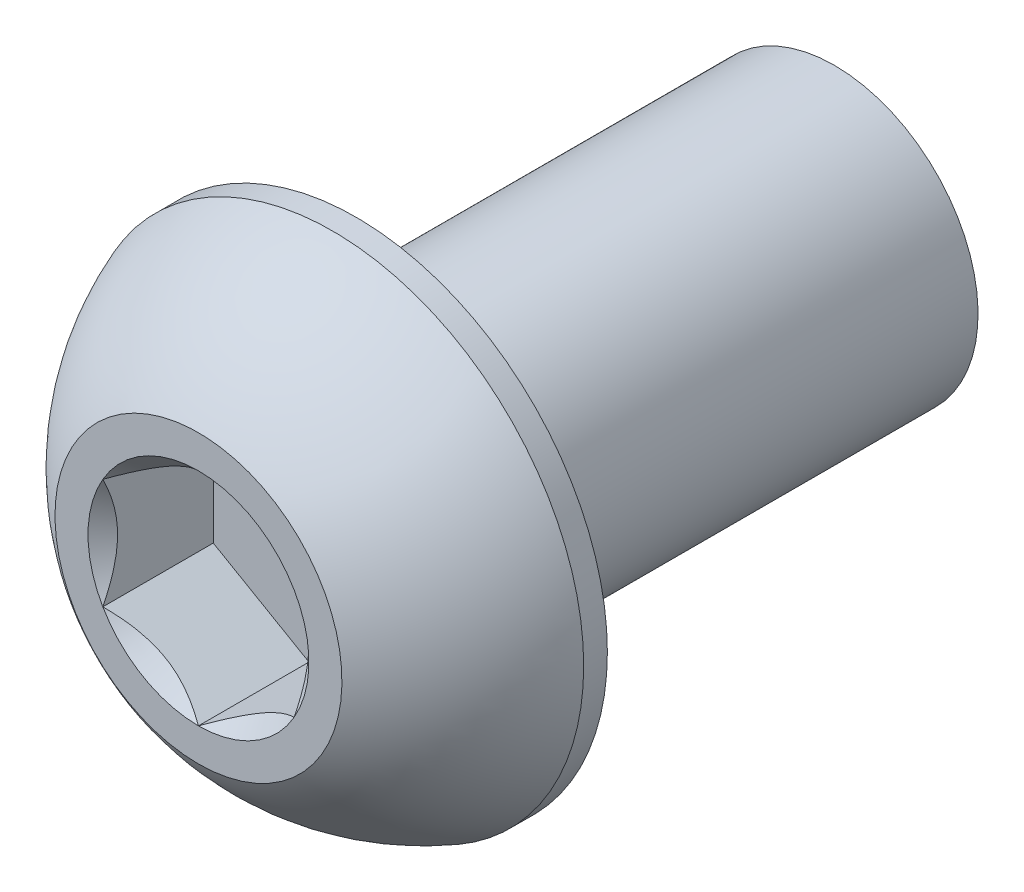
ISO-10303-21;
HEADER;
FILE_DESCRIPTION(('STEP AP214'),'2;1');
FILE_NAME('part.step','',(''),(''),'','','');
FILE_SCHEMA(('AUTOMOTIVE_DESIGN { 1 0 10303 214 1 1 1 1 }'));
ENDSEC;
DATA;
#1=APPLICATION_CONTEXT('core data for automotive mechanical design processes');
#2=APPLICATION_PROTOCOL_DEFINITION('international standard','automotive_design',2000,#1);
#3=PRODUCT_CONTEXT('',#1,'mechanical');
#4=PRODUCT('Part','Part','',(#3));
#5=PRODUCT_RELATED_PRODUCT_CATEGORY('part','',(#4));
#6=PRODUCT_DEFINITION_FORMATION('','',#4);
#7=PRODUCT_DEFINITION_CONTEXT('part definition',#1,'design');
#8=PRODUCT_DEFINITION('design','',#6,#7);
#9=PRODUCT_DEFINITION_SHAPE('','',#8);
#10=(LENGTH_UNIT() NAMED_UNIT(*) SI_UNIT(.MILLI.,.METRE.));
#11=(NAMED_UNIT(*) PLANE_ANGLE_UNIT() SI_UNIT($,.RADIAN.));
#12=(NAMED_UNIT(*) SI_UNIT($,.STERADIAN.) SOLID_ANGLE_UNIT());
#13=UNCERTAINTY_MEASURE_WITH_UNIT(LENGTH_MEASURE(1.E-05),#10,'distance_accuracy_value','');
#14=(GEOMETRIC_REPRESENTATION_CONTEXT(3) GLOBAL_UNCERTAINTY_ASSIGNED_CONTEXT((#13)) GLOBAL_UNIT_ASSIGNED_CONTEXT((#10,
#11,#12)) REPRESENTATION_CONTEXT('',''));
#15=CARTESIAN_POINT('',(0.,0.,0.));
#16=DIRECTION('',(0.,0.,1.));
#17=DIRECTION('',(1.,0.,0.));
#18=AXIS2_PLACEMENT_3D('',#15,#16,#17);
#19=CARTESIAN_POINT('',(-5.26,-5.25,-3.3));
#20=DIRECTION('',(0.,0.,-1.));
#21=DIRECTION('',(0.,1.,0.));
#22=AXIS2_PLACEMENT_3D('',#19,#20,#21);
#23=PLANE('',#22);
#24=CARTESIAN_POINT('',(0.,0.,-3.3));
#25=DIRECTION('',(0.,0.,1.));
#26=DIRECTION('',(1.,0.,0.));
#27=AXIS2_PLACEMENT_3D('',#24,#25,#26);
#28=CIRCLE('',#27,5.25);
#29=CARTESIAN_POINT('',(5.25,0.,-3.3));
#30=VERTEX_POINT('',#29);
#31=EDGE_CURVE('E371',#30,#30,#28,.T.);
#32=ORIENTED_EDGE('',*,*,#31,.F.);
#33=EDGE_LOOP('',(#32));
#34=FACE_BOUND('',#33,.T.);
#35=ADVANCED_FACE('F45',(#34),#23,.T.);
#36=CARTESIAN_POINT('',(2.,-1.15470053837925,-2.31));
#37=DIRECTION('',(0.,0.,1.));
#38=DIRECTION('',(1.,0.,0.));
#39=AXIS2_PLACEMENT_3D('',#36,#37,#38);
#40=PLANE('',#39);
#41=DIRECTION('',(0.866025403784438,0.5,0.));
#42=VECTOR('',#41,1.);
#43=CARTESIAN_POINT('',(0.,-2.3094010767585,-2.31));
#44=LINE('',#43,#42);
#45=CARTESIAN_POINT('',(0.,-2.3094010767585,-2.31));
#46=VERTEX_POINT('',#45);
#47=CARTESIAN_POINT('',(2.,-1.15470053837925,-2.31));
#48=VERTEX_POINT('',#47);
#49=EDGE_CURVE('E111',#46,#48,#44,.T.);
#50=ORIENTED_EDGE('',*,*,#49,.T.);
#51=DIRECTION('',(0.,1.,0.));
#52=VECTOR('',#51,1.);
#53=CARTESIAN_POINT('',(2.,-1.15470053837925,-2.31));
#54=LINE('',#53,#52);
#55=CARTESIAN_POINT('',(2.,1.15470053837925,-2.31));
#56=VERTEX_POINT('',#55);
#57=EDGE_CURVE('E168',#48,#56,#54,.T.);
#58=ORIENTED_EDGE('',*,*,#57,.T.);
#59=DIRECTION('',(-0.866025403784439,0.5,0.));
#60=VECTOR('',#59,1.);
#61=CARTESIAN_POINT('',(2.,1.15470053837925,-2.31));
#62=LINE('',#61,#60);
#63=CARTESIAN_POINT('',(0.,2.3094010767585,-2.31));
#64=VERTEX_POINT('',#63);
#65=EDGE_CURVE('E148',#56,#64,#62,.T.);
#66=ORIENTED_EDGE('',*,*,#65,.T.);
#67=DIRECTION('',(-0.866025403784438,-0.5,0.));
#68=VECTOR('',#67,1.);
#69=CARTESIAN_POINT('',(0.,2.3094010767585,-2.31));
#70=LINE('',#69,#68);
#71=CARTESIAN_POINT('',(-2.,1.15470053837925,-2.31));
#72=VERTEX_POINT('',#71);
#73=EDGE_CURVE('E164',#64,#72,#70,.T.);
#74=ORIENTED_EDGE('',*,*,#73,.T.);
#75=DIRECTION('',(0.,-1.,0.));
#76=VECTOR('',#75,1.);
#77=CARTESIAN_POINT('',(-2.,1.15470053837925,-2.31));
#78=LINE('',#77,#76);
#79=CARTESIAN_POINT('',(-2.,-1.15470053837925,-2.31));
#80=VERTEX_POINT('',#79);
#81=EDGE_CURVE('E161',#72,#80,#78,.T.);
#82=ORIENTED_EDGE('',*,*,#81,.T.);
#83=DIRECTION('',(0.866025403784439,-0.5,0.));
#84=VECTOR('',#83,1.);
#85=CARTESIAN_POINT('',(-2.,-1.15470053837925,-2.31));
#86=LINE('',#85,#84);
#87=EDGE_CURVE('E152',#80,#46,#86,.T.);
#88=ORIENTED_EDGE('',*,*,#87,.T.);
#89=EDGE_LOOP('',(#50,#58,#66,#74,#82,#88));
#90=FACE_BOUND('',#89,.T.);
#91=ADVANCED_FACE('F187',(#90),#40,.T.);
#92=CARTESIAN_POINT('',(-2.,-1.15470053837925,-2.31));
#93=DIRECTION('',(-0.5,-0.866025403784439,0.));
#94=DIRECTION('',(0.866025403784439,-0.5,0.));
#95=AXIS2_PLACEMENT_3D('',#92,#93,#94);
#96=PLANE('',#95);
#97=DIRECTION('',(0.,0.,1.));
#98=VECTOR('',#97,1.);
#99=CARTESIAN_POINT('',(-2.,-1.15470053837925,-2.31));
#100=LINE('',#99,#98);
#101=CARTESIAN_POINT('',(-2.,-1.15470053837925,0.));
#102=VERTEX_POINT('',#101);
#103=EDGE_CURVE('E118',#80,#102,#100,.T.);
#104=ORIENTED_EDGE('',*,*,#103,.T.);
#105=CARTESIAN_POINT('',(-2.0002,-1.15458506832541,0.000115478713659639));
#106=CARTESIAN_POINT('',(-1.93144696596929,-1.19427965103065,-0.039546909774408));
#107=CARTESIAN_POINT('',(-1.86154425786449,-1.23463799837204,-0.0768800177158382));
#108=CARTESIAN_POINT('',(-1.71900475544956,-1.31693321846145,-0.145236314863857));
#109=CARTESIAN_POINT('',(-1.64635440243464,-1.35887791933134,-0.176221466262779));
#110=CARTESIAN_POINT('',(-1.49985839894603,-1.44345742638069,-0.229299783455857));
#111=CARTESIAN_POINT('',(-1.42605006475371,-1.48607068799507,-0.251526372823389));
#112=CARTESIAN_POINT('',(-1.27680836816474,-1.57223542169503,-0.285771183324919));
#113=CARTESIAN_POINT('',(-1.20137956608185,-1.61578426088223,-0.297814970855865));
#114=CARTESIAN_POINT('',(-1.07138449932892,-1.69083694766536,-0.308681488094428));
#115=CARTESIAN_POINT('',(-1.01698621602989,-1.72224381117151,-0.310290246390029));
#116=CARTESIAN_POINT('',(-0.908278544480307,-1.78500621460364,-0.307581122401288));
#117=CARTESIAN_POINT('',(-0.853969194078661,-1.81636173267754,-0.303261162242026));
#118=CARTESIAN_POINT('',(-0.745863272410662,-1.87877671565355,-0.288940432590094));
#119=CARTESIAN_POINT('',(-0.692067343445208,-1.90983580972306,-0.278933307237993));
#120=CARTESIAN_POINT('',(-0.585405737694427,-1.97141691651548,-0.253787569750341));
#121=CARTESIAN_POINT('',(-0.532539989929288,-2.00193897021859,-0.23864935095776));
#122=CARTESIAN_POINT('',(-0.397120266910156,-2.08012358375727,-0.193705496570809));
#123=CARTESIAN_POINT('',(-0.315406165150521,-2.12730124240478,-0.160511160574184));
#124=CARTESIAN_POINT('',(-0.195252962742197,-2.19667172615922,-0.10447417682863));
#125=CARTESIAN_POINT('',(-0.155657147890822,-2.21953238052245,-0.0847852970530592));
#126=CARTESIAN_POINT('',(-0.0771990411121271,-2.26483018959124,-0.0436126816351277));
#127=CARTESIAN_POINT('',(-0.038336316406259,-2.28726759416161,-0.022130048348752));
#128=CARTESIAN_POINT('',(0.000200000000000792,-2.30951654681234,0.000115478713660523));
#129=B_SPLINE_CURVE_WITH_KNOTS('',3,(#105,#106,#107,#108,#109,#110,#111,#112,#113,#114,#115,
#116,#117,#118,#119,#120,#121,#122,#123,#124,#125,#126,#127,#128),.UNSPECIFIED.,.F.,.F.,(4,2,2,
2,2,2,2,2,2,2,2,4),(0.,0.266420613771064,0.534393751523388,0.798110374376914,1.06116288956936,
1.24939906803722,1.43770123566247,1.62621426093932,1.81471283831913,2.11415604834145,
2.26347170717791,2.41269626969771),.UNSPECIFIED.);
#130=CARTESIAN_POINT('',(0.,-2.3094010767585,0.));
#131=VERTEX_POINT('',#130);
#132=EDGE_CURVE('E103',#102,#131,#129,.T.);
#133=ORIENTED_EDGE('',*,*,#132,.T.);
#134=DIRECTION('',(0.,0.,1.));
#135=VECTOR('',#134,1.);
#136=CARTESIAN_POINT('',(0.,-2.3094010767585,-2.31));
#137=LINE('',#136,#135);
#138=EDGE_CURVE('E117',#46,#131,#137,.T.);
#139=ORIENTED_EDGE('',*,*,#138,.F.);
#140=ORIENTED_EDGE('',*,*,#87,.F.);
#141=EDGE_LOOP('',(#104,#133,#139,#140));
#142=FACE_BOUND('',#141,.T.);
#143=ADVANCED_FACE('F115',(#142),#96,.F.);
#144=CARTESIAN_POINT('',(0.,-2.3094010767585,-2.31));
#145=DIRECTION('',(0.5,-0.866025403784438,0.));
#146=DIRECTION('',(0.866025403784438,0.5,0.));
#147=AXIS2_PLACEMENT_3D('',#144,#145,#146);
#148=PLANE('',#147);
#149=ORIENTED_EDGE('',*,*,#138,.T.);
#150=CARTESIAN_POINT('',(-0.000199999999999157,-2.30951654681234,0.000115478713660375));
#151=CARTESIAN_POINT('',(0.0685530340307065,-2.26982196410711,-0.0395469097744072));
#152=CARTESIAN_POINT('',(0.138455742135513,-2.22946361676572,-0.0768800177158376));
#153=CARTESIAN_POINT('',(0.280995244550438,-2.1471683966763,-0.145236314863856));
#154=CARTESIAN_POINT('',(0.35364559756536,-2.10522369580642,-0.176221466262779));
#155=CARTESIAN_POINT('',(0.500141601053973,-2.02064418875706,-0.229299783455857));
#156=CARTESIAN_POINT('',(0.573949935246296,-1.97803092714269,-0.251526372823388));
#157=CARTESIAN_POINT('',(0.723191631835266,-1.89186619344273,-0.285771183324919));
#158=CARTESIAN_POINT('',(0.798620433918153,-1.84831735425552,-0.297814970855864));
#159=CARTESIAN_POINT('',(0.928615500671081,-1.7732646674724,-0.308681488094428));
#160=CARTESIAN_POINT('',(0.98301378397011,-1.74185780396625,-0.310290246390029));
#161=CARTESIAN_POINT('',(1.0917214555197,-1.67909540053412,-0.307581122401288));
#162=CARTESIAN_POINT('',(1.14603080592134,-1.64773988246021,-0.303261162242025));
#163=CARTESIAN_POINT('',(1.25413672758934,-1.5853248994842,-0.288940432590093));
#164=CARTESIAN_POINT('',(1.30793265655479,-1.55426580541469,-0.278933307237993));
#165=CARTESIAN_POINT('',(1.41459426230558,-1.49268469862228,-0.25378756975034));
#166=CARTESIAN_POINT('',(1.46746001007071,-1.46216264491917,-0.238649350957759));
#167=CARTESIAN_POINT('',(1.60287973308985,-1.38397803138049,-0.193705496570809));
#168=CARTESIAN_POINT('',(1.68459383484948,-1.33680037273297,-0.160511160574183));
#169=CARTESIAN_POINT('',(1.8047470372578,-1.26742988897853,-0.10447417682863));
#170=CARTESIAN_POINT('',(1.84434285210918,-1.24456923461531,-0.0847852970530592));
#171=CARTESIAN_POINT('',(1.92280095888787,-1.19927142554652,-0.043612681635128));
#172=CARTESIAN_POINT('',(1.96166368359374,-1.17683402097614,-0.0221300483487526));
#173=CARTESIAN_POINT('',(2.0002,-1.15458506832541,0.000115478713659639));
#174=B_SPLINE_CURVE_WITH_KNOTS('',3,(#150,#151,#152,#153,#154,#155,#156,#157,#158,#159,#160,
#161,#162,#163,#164,#165,#166,#167,#168,#169,#170,#171,#172,#173),.UNSPECIFIED.,.F.,.F.,(4,2,2,
2,2,2,2,2,2,2,2,4),(0.,0.266420613771064,0.534393751523389,0.798110374376915,1.06116288956936,
1.24939906803722,1.43770123566248,1.62621426093932,1.81471283831913,2.11415604834145,
2.26347170717791,2.41269626969771),.UNSPECIFIED.);
#175=CARTESIAN_POINT('',(2.,-1.15470053837925,0.));
#176=VERTEX_POINT('',#175);
#177=EDGE_CURVE('E108',#131,#176,#174,.T.);
#178=ORIENTED_EDGE('',*,*,#177,.T.);
#179=DIRECTION('',(0.,0.,1.));
#180=VECTOR('',#179,1.);
#181=CARTESIAN_POINT('',(2.,-1.15470053837925,-2.31));
#182=LINE('',#181,#180);
#183=EDGE_CURVE('E66',#48,#176,#182,.T.);
#184=ORIENTED_EDGE('',*,*,#183,.F.);
#185=ORIENTED_EDGE('',*,*,#49,.F.);
#186=EDGE_LOOP('',(#149,#178,#184,#185));
#187=FACE_BOUND('',#186,.T.);
#188=ADVANCED_FACE('F121',(#187),#148,.F.);
#189=CARTESIAN_POINT('',(2.,-1.15470053837925,-2.31));
#190=DIRECTION('',(1.,0.,0.));
#191=DIRECTION('',(0.,0.,-1.));
#192=AXIS2_PLACEMENT_3D('',#189,#190,#191);
#193=PLANE('',#192);
#194=ORIENTED_EDGE('',*,*,#183,.T.);
#195=CARTESIAN_POINT('',(2.,-2.30294417292923,0.740771355027722));
#196=CARTESIAN_POINT('',(2.,-2.24687002663712,0.698443273625964));
#197=CARTESIAN_POINT('',(2.,-2.19048190536959,0.656525156864338));
#198=CARTESIAN_POINT('',(2.,-2.07695390496424,0.573690417861018));
#199=CARTESIAN_POINT('',(2.,-2.01981384066454,0.532774049668075));
#200=CARTESIAN_POINT('',(2.,-1.90424016804776,0.451833452018564));
#201=CARTESIAN_POINT('',(2.,-1.8457999674391,0.411818591559869));
#202=CARTESIAN_POINT('',(2.,-1.7279274546176,0.333288993664294));
#203=CARTESIAN_POINT('',(2.,-1.66849521292324,0.294774150243143));
#204=CARTESIAN_POINT('',(2.,-1.4816299571002,0.177640651604295));
#205=CARTESIAN_POINT('',(2.,-1.35220318163536,0.102145901729644));
#206=CARTESIAN_POINT('',(2.,-1.08689521592924,-0.0359506490056185));
#207=CARTESIAN_POINT('',(2.,-0.951037763938192,-0.0985959140965039));
#208=CARTESIAN_POINT('',(2.,-0.747111912259408,-0.175236456124856));
#209=CARTESIAN_POINT('',(2.,-0.682064034147875,-0.197232820080877));
#210=CARTESIAN_POINT('',(2.,-0.550398103294752,-0.23600331233986));
#211=CARTESIAN_POINT('',(2.,-0.483779942722475,-0.252777080878817));
#212=CARTESIAN_POINT('',(2.,-0.350484328847654,-0.279951742115554));
#213=CARTESIAN_POINT('',(2.,-0.283829489364785,-0.290461823258313));
#214=CARTESIAN_POINT('',(2.,-0.149806987139376,-0.304903914455084));
#215=CARTESIAN_POINT('',(2.,-0.0824394489341213,-0.308837055266886));
#216=CARTESIAN_POINT('',(2.,0.0499055622944902,-0.309833523066282));
#217=CARTESIAN_POINT('',(2.,0.114881285143173,-0.307140355149591));
#218=CARTESIAN_POINT('',(2.,0.244275921482761,-0.295569929577307));
#219=CARTESIAN_POINT('',(2.,0.308694780266754,-0.286692071166775));
#220=CARTESIAN_POINT('',(2.,0.437599788610705,-0.263086340703851));
#221=CARTESIAN_POINT('',(2.,0.502067428644596,-0.248258916553488));
#222=CARTESIAN_POINT('',(2.,0.629594322598307,-0.21354211637203));
#223=CARTESIAN_POINT('',(2.,0.692653693883151,-0.193653163893724));
#224=CARTESIAN_POINT('',(2.,0.891187889210545,-0.123553020743801));
#225=CARTESIAN_POINT('',(2.,1.02383545707306,-0.065358199678491));
#226=CARTESIAN_POINT('',(2.,1.28290932150074,0.0640305754595764));
#227=CARTESIAN_POINT('',(2.,1.4093111258757,0.135271231414842));
#228=CARTESIAN_POINT('',(2.,1.59200441438963,0.246441991874721));
#229=CARTESIAN_POINT('',(2.,1.65027549026191,0.283182190337375));
#230=CARTESIAN_POINT('',(2.,1.76581760389243,0.358214514183766));
#231=CARTESIAN_POINT('',(2.,1.82308856543105,0.396506757118039));
#232=CARTESIAN_POINT('',(2.,1.93629654762084,0.474042264081225));
#233=CARTESIAN_POINT('',(2.,1.99224062500539,0.513275276133585));
#234=CARTESIAN_POINT('',(2.,2.103364240299,0.592778830736515));
#235=CARTESIAN_POINT('',(2.,2.15854398422468,0.633049085000597));
#236=CARTESIAN_POINT('',(2.,2.21340370692659,0.673744238145941));
#237=B_SPLINE_CURVE_WITH_KNOTS('',3,(#195,#196,#197,#198,#199,#200,#201,#202,#203,#204,#205,
#206,#207,#208,#209,#210,#211,#212,#213,#214,#215,#216,#217,#218,#219,#220,#221,#222,#223,#224,
#225,#226,#227,#228,#229,#230,#231,#232,#233,#234,#235,#236),.UNSPECIFIED.,.F.,.F.,(4,2,2,2,2,2,
2,2,2,2,2,2,2,2,2,2,2,2,2,2,4),(0.,0.210772731976892,0.42159837465859,0.634057554623488,
0.84650169587017,1.29562155455624,1.74319622821645,1.94902062110207,2.15485918928326,
2.35699582502635,2.5590977043214,2.75388435553556,2.94868993014815,3.14690093452586,
3.34509535789702,3.77838155837654,4.21325029921625,4.41989056685647,4.62654651460921,
4.83152377111289,5.03644465914085),.UNSPECIFIED.);
#238=CARTESIAN_POINT('',(2.,1.15470053837925,0.));
#239=VERTEX_POINT('',#238);
#240=EDGE_CURVE('E134',#176,#239,#237,.T.);
#241=ORIENTED_EDGE('',*,*,#240,.T.);
#242=DIRECTION('',(0.,0.,1.));
#243=VECTOR('',#242,1.);
#244=CARTESIAN_POINT('',(2.,1.15470053837925,-2.31));
#245=LINE('',#244,#243);
#246=EDGE_CURVE('E138',#56,#239,#245,.T.);
#247=ORIENTED_EDGE('',*,*,#246,.F.);
#248=ORIENTED_EDGE('',*,*,#57,.F.);
#249=EDGE_LOOP('',(#194,#241,#247,#248));
#250=FACE_BOUND('',#249,.T.);
#251=ADVANCED_FACE('F137',(#250),#193,.F.);
#252=CARTESIAN_POINT('',(2.,1.15470053837925,-2.31));
#253=DIRECTION('',(0.5,0.866025403784439,0.));
#254=DIRECTION('',(-0.866025403784439,0.5,0.));
#255=AXIS2_PLACEMENT_3D('',#252,#253,#254);
#256=PLANE('',#255);
#257=ORIENTED_EDGE('',*,*,#246,.T.);
#258=CARTESIAN_POINT('',(2.0002,1.15458506832541,0.000115478713659639));
#259=CARTESIAN_POINT('',(1.93144696596929,1.19427965103065,-0.0395469097744079));
#260=CARTESIAN_POINT('',(1.86154425786449,1.23463799837204,-0.0768800177158382));
#261=CARTESIAN_POINT('',(1.71900475544956,1.31693321846145,-0.145236314863857));
#262=CARTESIAN_POINT('',(1.64635440243464,1.35887791933134,-0.17622146626278));
#263=CARTESIAN_POINT('',(1.49985839894603,1.44345742638069,-0.229299783455858));
#264=CARTESIAN_POINT('',(1.4260500647537,1.48607068799507,-0.25152637282339));
#265=CARTESIAN_POINT('',(1.27680836816473,1.57223542169503,-0.28577118332492));
#266=CARTESIAN_POINT('',(1.20137956608185,1.61578426088223,-0.297814970855865));
#267=CARTESIAN_POINT('',(1.07138449932892,1.69083694766536,-0.308681488094429));
#268=CARTESIAN_POINT('',(1.01698621602989,1.72224381117151,-0.31029024639003));
#269=CARTESIAN_POINT('',(0.908278544480305,1.78500621460364,-0.307581122401289));
#270=CARTESIAN_POINT('',(0.85396919407866,1.81636173267754,-0.303261162242026));
#271=CARTESIAN_POINT('',(0.745863272410661,1.87877671565355,-0.288940432590094));
#272=CARTESIAN_POINT('',(0.692067343445206,1.90983580972306,-0.278933307237994));
#273=CARTESIAN_POINT('',(0.585405737694425,1.97141691651547,-0.253787569750341));
#274=CARTESIAN_POINT('',(0.532539989929286,2.00193897021859,-0.238649350957761));
#275=CARTESIAN_POINT('',(0.397120266910155,2.08012358375727,-0.19370549657081));
#276=CARTESIAN_POINT('',(0.31540616515052,2.12730124240478,-0.160511160574185));
#277=CARTESIAN_POINT('',(0.195252962742197,2.19667172615922,-0.104474176828631));
#278=CARTESIAN_POINT('',(0.155657147890822,2.21953238052245,-0.0847852970530605));
#279=CARTESIAN_POINT('',(0.0771990411121276,2.26483018959123,-0.0436126816351292));
#280=CARTESIAN_POINT('',(0.0383363164062596,2.28726759416161,-0.0221300483487536));
#281=CARTESIAN_POINT('',(-0.000200000000000117,2.30951654681234,0.00011547871365879));
#282=B_SPLINE_CURVE_WITH_KNOTS('',3,(#258,#259,#260,#261,#262,#263,#264,#265,#266,#267,#268,
#269,#270,#271,#272,#273,#274,#275,#276,#277,#278,#279,#280,#281),.UNSPECIFIED.,.F.,.F.,(4,2,2,
2,2,2,2,2,2,2,2,4),(0.,0.266420613771064,0.534393751523389,0.798110374376916,1.06116288956937,
1.24939906803722,1.43770123566248,1.62621426093932,1.81471283831913,2.11415604834145,
2.2634717071779,2.41269626969771),.UNSPECIFIED.);
#283=CARTESIAN_POINT('',(0.,2.3094010767585,0.));
#284=VERTEX_POINT('',#283);
#285=EDGE_CURVE('E145',#239,#284,#282,.T.);
#286=ORIENTED_EDGE('',*,*,#285,.T.);
#287=DIRECTION('',(0.,0.,1.));
#288=VECTOR('',#287,1.);
#289=CARTESIAN_POINT('',(0.,2.3094010767585,-2.31));
#290=LINE('',#289,#288);
#291=EDGE_CURVE('E150',#64,#284,#290,.T.);
#292=ORIENTED_EDGE('',*,*,#291,.F.);
#293=ORIENTED_EDGE('',*,*,#65,.F.);
#294=EDGE_LOOP('',(#257,#286,#292,#293));
#295=FACE_BOUND('',#294,.T.);
#296=ADVANCED_FACE('F144',(#295),#256,.F.);
#297=CARTESIAN_POINT('',(0.,2.3094010767585,-2.31));
#298=DIRECTION('',(-0.5,0.866025403784438,0.));
#299=DIRECTION('',(-0.866025403784438,-0.5,0.));
#300=AXIS2_PLACEMENT_3D('',#297,#298,#299);
#301=PLANE('',#300);
#302=ORIENTED_EDGE('',*,*,#291,.T.);
#303=CARTESIAN_POINT('',(0.000199999999999811,2.30951654681234,0.000115478713659074));
#304=CARTESIAN_POINT('',(-0.0685530340307058,2.26982196410711,-0.0395469097744086));
#305=CARTESIAN_POINT('',(-0.138455742135512,2.22946361676572,-0.0768800177158388));
#306=CARTESIAN_POINT('',(-0.280995244550437,2.1471683966763,-0.145236314863858));
#307=CARTESIAN_POINT('',(-0.353645597565359,2.10522369580642,-0.17622146626278));
#308=CARTESIAN_POINT('',(-0.500141601053972,2.02064418875706,-0.229299783455858));
#309=CARTESIAN_POINT('',(-0.573949935246295,1.97803092714269,-0.25152637282339));
#310=CARTESIAN_POINT('',(-0.723191631835265,1.89186619344273,-0.28577118332492));
#311=CARTESIAN_POINT('',(-0.798620433918153,1.84831735425552,-0.297814970855866));
#312=CARTESIAN_POINT('',(-0.92861550067108,1.7732646674724,-0.308681488094429));
#313=CARTESIAN_POINT('',(-0.98301378397011,1.74185780396625,-0.31029024639003));
#314=CARTESIAN_POINT('',(-1.09172145551969,1.67909540053412,-0.30758112240129));
#315=CARTESIAN_POINT('',(-1.14603080592134,1.64773988246021,-0.303261162242027));
#316=CARTESIAN_POINT('',(-1.25413672758934,1.5853248994842,-0.288940432590095));
#317=CARTESIAN_POINT('',(-1.30793265655479,1.55426580541469,-0.278933307237995));
#318=CARTESIAN_POINT('',(-1.41459426230557,1.49268469862228,-0.253787569750342));
#319=CARTESIAN_POINT('',(-1.46746001007071,1.46216264491916,-0.238649350957761));
#320=CARTESIAN_POINT('',(-1.60287973308984,1.38397803138048,-0.19370549657081));
#321=CARTESIAN_POINT('',(-1.68459383484948,1.33680037273297,-0.160511160574184));
#322=CARTESIAN_POINT('',(-1.8047470372578,1.26742988897853,-0.104474176828631));
#323=CARTESIAN_POINT('',(-1.84434285210918,1.24456923461531,-0.0847852970530608));
#324=CARTESIAN_POINT('',(-1.92280095888787,1.19927142554652,-0.0436126816351296));
#325=CARTESIAN_POINT('',(-1.96166368359374,1.17683402097614,-0.0221300483487539));
#326=CARTESIAN_POINT('',(-2.0002,1.15458506832541,0.000115478713658797));
#327=B_SPLINE_CURVE_WITH_KNOTS('',3,(#303,#304,#305,#306,#307,#308,#309,#310,#311,#312,#313,
#314,#315,#316,#317,#318,#319,#320,#321,#322,#323,#324,#325,#326),.UNSPECIFIED.,.F.,.F.,(4,2,2,
2,2,2,2,2,2,2,2,4),(0.,0.266420613771064,0.534393751523389,0.798110374376915,1.06116288956936,
1.24939906803722,1.43770123566248,1.62621426093932,1.81471283831913,2.11415604834145,
2.26347170717791,2.41269626969771),.UNSPECIFIED.);
#328=CARTESIAN_POINT('',(-2.,1.15470053837925,0.));
#329=VERTEX_POINT('',#328);
#330=EDGE_CURVE('E204',#284,#329,#327,.T.);
#331=ORIENTED_EDGE('',*,*,#330,.T.);
#332=DIRECTION('',(0.,0.,1.));
#333=VECTOR('',#332,1.);
#334=CARTESIAN_POINT('',(-2.,1.15470053837925,-2.31));
#335=LINE('',#334,#333);
#336=EDGE_CURVE('E154',#72,#329,#335,.T.);
#337=ORIENTED_EDGE('',*,*,#336,.F.);
#338=ORIENTED_EDGE('',*,*,#73,.F.);
#339=EDGE_LOOP('',(#302,#331,#337,#338));
#340=FACE_BOUND('',#339,.T.);
#341=ADVANCED_FACE('F218',(#340),#301,.F.);
#342=CARTESIAN_POINT('',(-2.,1.15470053837925,-2.31));
#343=DIRECTION('',(-1.,0.,0.));
#344=DIRECTION('',(0.,0.,1.));
#345=AXIS2_PLACEMENT_3D('',#342,#343,#344);
#346=PLANE('',#345);
#347=ORIENTED_EDGE('',*,*,#336,.T.);
#348=CARTESIAN_POINT('',(-2.,-2.30294417292923,0.740771355027724));
#349=CARTESIAN_POINT('',(-2.,-2.24687002663712,0.698443273625966));
#350=CARTESIAN_POINT('',(-2.,-2.19048190536959,0.65652515686434));
#351=CARTESIAN_POINT('',(-2.,-2.07695390496424,0.57369041786102));
#352=CARTESIAN_POINT('',(-2.,-2.01981384066454,0.532774049668076));
#353=CARTESIAN_POINT('',(-2.,-1.90424016804776,0.451833452018565));
#354=CARTESIAN_POINT('',(-2.,-1.8457999674391,0.41181859155987));
#355=CARTESIAN_POINT('',(-2.,-1.7279274546176,0.333288993664295));
#356=CARTESIAN_POINT('',(-2.,-1.66849521292324,0.294774150243144));
#357=CARTESIAN_POINT('',(-2.,-1.4816299571002,0.177640651604296));
#358=CARTESIAN_POINT('',(-2.,-1.35220318163536,0.102145901729645));
#359=CARTESIAN_POINT('',(-2.,-1.08689521592925,-0.0359506490056179));
#360=CARTESIAN_POINT('',(-2.,-0.951037763938192,-0.0985959140965036));
#361=CARTESIAN_POINT('',(-2.,-0.747111912259409,-0.175236456124856));
#362=CARTESIAN_POINT('',(-2.,-0.682064034147876,-0.197232820080876));
#363=CARTESIAN_POINT('',(-2.,-0.550398103294752,-0.23600331233986));
#364=CARTESIAN_POINT('',(-2.,-0.483779942722475,-0.252777080878817));
#365=CARTESIAN_POINT('',(-2.,-0.350484328847654,-0.279951742115554));
#366=CARTESIAN_POINT('',(-2.,-0.283829489364785,-0.290461823258313));
#367=CARTESIAN_POINT('',(-2.,-0.149806987139376,-0.304903914455084));
#368=CARTESIAN_POINT('',(-2.,-0.0824394489341216,-0.308837055266886));
#369=CARTESIAN_POINT('',(-2.,0.04990556229449,-0.309833523066282));
#370=CARTESIAN_POINT('',(-2.,0.114881285143172,-0.307140355149591));
#371=CARTESIAN_POINT('',(-2.,0.244275921482761,-0.295569929577307));
#372=CARTESIAN_POINT('',(-2.,0.308694780266753,-0.286692071166775));
#373=CARTESIAN_POINT('',(-2.,0.437599788610705,-0.263086340703851));
#374=CARTESIAN_POINT('',(-2.,0.502067428644595,-0.248258916553488));
#375=CARTESIAN_POINT('',(-2.,0.629594322598306,-0.21354211637203));
#376=CARTESIAN_POINT('',(-2.,0.692653693883151,-0.193653163893724));
#377=CARTESIAN_POINT('',(-2.,0.891187889210545,-0.123553020743801));
#378=CARTESIAN_POINT('',(-2.,1.02383545707306,-0.0653581996784915));
#379=CARTESIAN_POINT('',(-2.,1.28290932150074,0.0640305754595762));
#380=CARTESIAN_POINT('',(-2.,1.4093111258757,0.135271231414841));
#381=CARTESIAN_POINT('',(-2.,1.59200441438963,0.24644199187472));
#382=CARTESIAN_POINT('',(-2.,1.65027549026191,0.283182190337374));
#383=CARTESIAN_POINT('',(-2.,1.76581760389243,0.358214514183765));
#384=CARTESIAN_POINT('',(-2.,1.82308856543104,0.396506757118039));
#385=CARTESIAN_POINT('',(-2.,1.93629654762084,0.474042264081225));
#386=CARTESIAN_POINT('',(-2.,1.99224062500539,0.513275276133584));
#387=CARTESIAN_POINT('',(-2.,2.103364240299,0.592778830736514));
#388=CARTESIAN_POINT('',(-2.,2.15854398422468,0.633049085000596));
#389=CARTESIAN_POINT('',(-2.,2.21340370692658,0.673744238145941));
#390=B_SPLINE_CURVE_WITH_KNOTS('',3,(#348,#349,#350,#351,#352,#353,#354,#355,#356,#357,#358,
#359,#360,#361,#362,#363,#364,#365,#366,#367,#368,#369,#370,#371,#372,#373,#374,#375,#376,#377,
#378,#379,#380,#381,#382,#383,#384,#385,#386,#387,#388,#389),.UNSPECIFIED.,.F.,.F.,(4,2,2,2,2,2,
2,2,2,2,2,2,2,2,2,2,2,2,2,2,4),(0.,0.210772731976892,0.42159837465859,0.634057554623489,
0.846501695870171,1.29562155455624,1.74319622821645,1.94902062110208,2.15485918928326,
2.35699582502636,2.5590977043214,2.75388435553556,2.94868993014815,3.14690093452586,
3.34509535789702,3.77838155837654,4.21325029921625,4.41989056685647,4.62654651460921,
4.8315237711129,5.03644465914085),.UNSPECIFIED.);
#391=EDGE_CURVE('E119',#329,#102,#390,.F.);
#392=ORIENTED_EDGE('',*,*,#391,.T.);
#393=ORIENTED_EDGE('',*,*,#103,.F.);
#394=ORIENTED_EDGE('',*,*,#81,.F.);
#395=EDGE_LOOP('',(#347,#392,#393,#394));
#396=FACE_BOUND('',#395,.T.);
#397=ADVANCED_FACE('F215',(#396),#346,.F.);
#398=CARTESIAN_POINT('',(0.,0.,0.));
#399=DIRECTION('',(0.,0.,1.));
#400=DIRECTION('',(1.,0.,0.));
#401=AXIS2_PLACEMENT_3D('',#398,#399,#400);
#402=CONICAL_SURFACE('',#401,2.3094010767585,0.78539816339745);
#403=CARTESIAN_POINT('',(0.,0.,0.));
#404=DIRECTION('',(0.,0.,1.));
#405=DIRECTION('',(1.,0.,0.));
#406=AXIS2_PLACEMENT_3D('',#403,#404,#405);
#407=CIRCLE('',#406,2.3094010767585);
#408=EDGE_CURVE('E100',#102,#131,#407,.T.);
#409=ORIENTED_EDGE('',*,*,#408,.T.);
#410=ORIENTED_EDGE('',*,*,#132,.F.);
#411=EDGE_LOOP('',(#409,#410));
#412=FACE_BOUND('',#411,.T.);
#413=ADVANCED_FACE('F101',(#412),#402,.F.);
#414=EDGE_CURVE('E53',#131,#176,#407,.T.);
#415=ORIENTED_EDGE('',*,*,#414,.T.);
#416=ORIENTED_EDGE('',*,*,#177,.F.);
#417=EDGE_LOOP('',(#415,#416));
#418=FACE_BOUND('',#417,.T.);
#419=ADVANCED_FACE('F109',(#418),#402,.F.);
#420=EDGE_CURVE('E12',#176,#239,#407,.T.);
#421=ORIENTED_EDGE('',*,*,#420,.T.);
#422=ORIENTED_EDGE('',*,*,#240,.F.);
#423=EDGE_LOOP('',(#421,#422));
#424=FACE_BOUND('',#423,.T.);
#425=ADVANCED_FACE('F133',(#424),#402,.F.);
#426=EDGE_CURVE('E48',#239,#284,#407,.T.);
#427=ORIENTED_EDGE('',*,*,#426,.T.);
#428=ORIENTED_EDGE('',*,*,#285,.F.);
#429=EDGE_LOOP('',(#427,#428));
#430=FACE_BOUND('',#429,.T.);
#431=ADVANCED_FACE('F317',(#430),#402,.F.);
#432=EDGE_CURVE('E242',#284,#329,#407,.T.);
#433=ORIENTED_EDGE('',*,*,#432,.T.);
#434=ORIENTED_EDGE('',*,*,#330,.F.);
#435=EDGE_LOOP('',(#433,#434));
#436=FACE_BOUND('',#435,.T.);
#437=ADVANCED_FACE('F243',(#436),#402,.F.);
#438=EDGE_CURVE('E107',#329,#102,#407,.T.);
#439=ORIENTED_EDGE('',*,*,#438,.T.);
#440=ORIENTED_EDGE('',*,*,#391,.F.);
#441=EDGE_LOOP('',(#439,#440));
#442=FACE_BOUND('',#441,.T.);
#443=ADVANCED_FACE('F239',(#442),#402,.F.);
#444=CARTESIAN_POINT('',(0.,-3.,0.));
#445=DIRECTION('',(0.,0.,-1.));
#446=DIRECTION('',(-1.,0.,0.));
#447=AXIS2_PLACEMENT_3D('',#444,#445,#446);
#448=PLANE('',#447);
#449=ORIENTED_EDGE('',*,*,#438,.F.);
#450=ORIENTED_EDGE('',*,*,#432,.F.);
#451=ORIENTED_EDGE('',*,*,#426,.F.);
#452=ORIENTED_EDGE('',*,*,#420,.F.);
#453=ORIENTED_EDGE('',*,*,#414,.F.);
#454=ORIENTED_EDGE('',*,*,#408,.F.);
#455=EDGE_LOOP('',(#449,#450,#451,#452,#453,#454));
#456=FACE_BOUND('',#455,.T.);
#457=CARTESIAN_POINT('',(0.,0.,0.));
#458=DIRECTION('',(0.,0.,1.));
#459=DIRECTION('',(1.,0.,0.));
#460=AXIS2_PLACEMENT_3D('',#457,#458,#459);
#461=CIRCLE('',#460,3.);
#462=CARTESIAN_POINT('',(0.,-3.,0.));
#463=VERTEX_POINT('',#462);
#464=EDGE_CURVE('E140',#463,#463,#461,.T.);
#465=ORIENTED_EDGE('',*,*,#464,.T.);
#466=EDGE_LOOP('',(#465));
#467=FACE_BOUND('',#466,.T.);
#468=ADVANCED_FACE('F127',(#456,#467),#448,.F.);
#469=CARTESIAN_POINT('',(0.,0.,-4.71132352941176));
#470=DIRECTION('',(0.,0.,1.));
#471=DIRECTION('',(0.,-1.,0.));
#472=AXIS2_PLACEMENT_3D('',#469,#470,#471);
#473=SPHERICAL_SURFACE('',#472,5.58538892099636);
#474=CARTESIAN_POINT('',(0.,0.,-2.805));
#475=DIRECTION('',(0.,0.,1.));
#476=DIRECTION('',(1.,0.,0.));
#477=AXIS2_PLACEMENT_3D('',#474,#475,#476);
#478=CIRCLE('',#477,5.25);
#479=CARTESIAN_POINT('',(0.,-5.25,-2.805));
#480=VERTEX_POINT('',#479);
#481=EDGE_CURVE('E124',#480,#480,#478,.T.);
#482=CARTESIAN_POINT('',(0.,-3.,0.));
#483=CARTESIAN_POINT('',(0.,-3.03216841047471,-0.0204836076687066));
#484=CARTESIAN_POINT('',(0.,-3.06412696701745,-0.0412967747060141));
#485=CARTESIAN_POINT('',(0.,-3.12761110680185,-0.0835732798883749));
#486=CARTESIAN_POINT('',(0.,-3.1591366900435,-0.105036618033428));
#487=CARTESIAN_POINT('',(0.,-3.22174161778855,-0.148604517801823));
#488=CARTESIAN_POINT('',(0.,-3.25282096229196,-0.170709079425165));
#489=CARTESIAN_POINT('',(0.,-3.3145203830256,-0.215550136391722));
#490=CARTESIAN_POINT('',(0.,-3.34514045925583,-0.238286631734938));
#491=CARTESIAN_POINT('',(0.,-3.40590849355866,-0.284382020830628));
#492=CARTESIAN_POINT('',(0.,-3.43605645163127,-0.307740914583101));
#493=CARTESIAN_POINT('',(0.,-3.49586760131366,-0.355071298801884));
#494=CARTESIAN_POINT('',(0.,-3.52553079292345,-0.379042789268193));
#495=CARTESIAN_POINT('',(0.,-3.58435996382991,-0.427588309600936));
#496=CARTESIAN_POINT('',(0.,-3.61352594312657,-0.45216233946737));
#497=CARTESIAN_POINT('',(0.,-3.67134845242053,-0.501902628105113));
#498=CARTESIAN_POINT('',(0.,-3.70000498241782,-0.527068886876421));
#499=CARTESIAN_POINT('',(0.,-3.7567965698069,-0.577983074450791));
#500=CARTESIAN_POINT('',(0.,-3.78493162719868,-0.603731003253852));
#501=CARTESIAN_POINT('',(0.,-3.84066846488056,-0.655797727942868));
#502=CARTESIAN_POINT('',(0.,-3.86827024517066,-0.682116523828822));
#503=CARTESIAN_POINT('',(0.,-3.92292894789283,-0.735313940225864));
#504=CARTESIAN_POINT('',(0.,-3.94998587032491,-0.762192560736952));
#505=CARTESIAN_POINT('',(0.,-4.00354350517958,-0.816498349041451));
#506=CARTESIAN_POINT('',(0.,-4.03004421760217,-0.843925516834863));
#507=CARTESIAN_POINT('',(0.,-4.08247831365261,-0.899316892210193));
#508=CARTESIAN_POINT('',(0.,-4.10841169728045,-0.927281099792112));
#509=CARTESIAN_POINT('',(0.,-4.1597002549878,-0.983734821927125));
#510=CARTESIAN_POINT('',(0.,-4.18505542906731,-1.01222433648022));
#511=CARTESIAN_POINT('',(0.,-4.23517692952119,-1.06971671933959));
#512=CARTESIAN_POINT('',(0.,-4.25994325589556,-1.09871958764587));
#513=CARTESIAN_POINT('',(0.,-4.30887666984256,-1.15722650940808));
#514=CARTESIAN_POINT('',(0.,-4.33304375741518,-1.18673056286401));
#515=CARTESIAN_POINT('',(0.,-4.38076855408201,-1.24622747604199));
#516=CARTESIAN_POINT('',(0.,-4.40432626317621,-1.27622033576403));
#517=CARTESIAN_POINT('',(0.,-4.45082241888372,-1.33668227750444));
#518=CARTESIAN_POINT('',(0.,-4.47376086549703,-1.3671513595228));
#519=CARTESIAN_POINT('',(0.,-4.51900887206146,-1.4285529620796));
#520=CARTESIAN_POINT('',(0.,-4.54131843201258,-1.45948548261803));
#521=CARTESIAN_POINT('',(0.,-4.58529930493053,-1.52180098399588));
#522=CARTESIAN_POINT('',(0.,-4.60697061789735,-1.5531839648353));
#523=CARTESIAN_POINT('',(0.,-4.64966590431095,-1.61638721959847));
#524=CARTESIAN_POINT('',(0.,-4.67068987775773,-1.64820749352221));
#525=CARTESIAN_POINT('',(0.,-4.71208166419702,-1.71227198376418));
#526=CARTESIAN_POINT('',(0.,-4.73244947718953,-1.74451620008241));
#527=CARTESIAN_POINT('',(0.,-4.77252039708775,-1.80941504655213));
#528=CARTESIAN_POINT('',(0.,-4.79222350399347,-1.84206967670363));
#529=CARTESIAN_POINT('',(0.,-4.83095674497554,-1.90777565008234));
#530=CARTESIAN_POINT('',(0.,-4.84998687905189,-1.94082699330955));
#531=CARTESIAN_POINT('',(0.,-4.8873661899807,-2.00731252563814));
#532=CARTESIAN_POINT('',(0.,-4.90571536683316,-2.04074671473953));
#533=CARTESIAN_POINT('',(0.,-4.94172506465618,-2.10798391097428));
#534=CARTESIAN_POINT('',(0.,-4.95938558562673,-2.14178691810765));
#535=CARTESIAN_POINT('',(0.,-4.99401056185103,-2.20974756786458));
#536=CARTESIAN_POINT('',(0.,-5.01097501710478,-2.24390521048815));
#537=CARTESIAN_POINT('',(0.,-5.04420074452798,-2.31256079972767));
#538=CARTESIAN_POINT('',(0.,-5.06046201669743,-2.34705874634363));
#539=CARTESIAN_POINT('',(0.,-5.09227455404011,-2.41638046989934));
#540=CARTESIAN_POINT('',(0.,-5.10782581921333,-2.45120424683909));
#541=CARTESIAN_POINT('',(0.,-5.13821182242717,-2.52116301839372));
#542=CARTESIAN_POINT('',(0.,-5.15304656046779,-2.5562980130086));
#543=CARTESIAN_POINT('',(0.,-5.18199326796146,-2.62686448517116));
#544=CARTESIAN_POINT('',(0.,-5.19610523741451,-2.66229596271883));
#545=CARTESIAN_POINT('',(0.,-5.22360055144049,-2.7334405099534));
#546=CARTESIAN_POINT('',(0.,-5.23698389601341,-2.76915357964029));
#547=CARTESIAN_POINT('',(0.,-5.25,-2.805));
#548=B_SPLINE_CURVE_WITH_KNOTS('',3,(#482,#483,#484,#485,#486,#487,#488,#489,#490,#491,#492,
#493,#494,#495,#496,#497,#498,#499,#500,#501,#502,#503,#504,#505,#506,#507,#508,#509,#510,#511,
#512,#513,#514,#515,#516,#517,#518,#519,#520,#521,#522,#523,#524,#525,#526,#527,#528,#529,#530,
#531,#532,#533,#534,#535,#536,#537,#538,#539,#540,#541,#542,#543,#544,#545,#546,#547),
.UNSPECIFIED.,.F.,.F.,(4,2,2,2,2,2,2,2,2,2,2,2,2,2,2,2,2,2,2,2,2,2,2,2,2,2,2,2,2,2,2,2,4),(0.,
0.114407188898184,0.228814377796368,0.343221566694552,0.457628755592736,0.57203594449092,
0.686443133389104,0.800850322287288,0.915257511185472,1.02966470008366,1.14407188898184,
1.25847907788002,1.37288626677821,1.48729345567639,1.60170064457458,1.71610783347276,
1.83051502237094,1.94492221126913,2.05932940016731,2.17373658906549,2.28814377796368,
2.40255096686186,2.51695815576005,2.63136534465823,2.74577253355642,2.8601797224546,
2.97458691135278,3.08899410025097,3.20340128914915,3.31780847804733,3.43221566694552,
3.5466228558437,3.66103004474189),.UNSPECIFIED.);
#549=EDGE_CURVE('BSEAM288',#463,#480,#548,.T.);
#550=ORIENTED_EDGE('',*,*,#464,.F.);
#551=ORIENTED_EDGE('',*,*,#481,.T.);
#552=ORIENTED_EDGE('',*,*,#549,.T.);
#553=ORIENTED_EDGE('',*,*,#549,.F.);
#554=EDGE_LOOP('',(#550,#552,#551,#553));
#555=FACE_BOUND('',#554,.T.);
#556=ADVANCED_FACE('F288',(#555),#473,.T.);
#557=CARTESIAN_POINT('',(0.,0.,0.));
#558=DIRECTION('',(0.,0.,1.));
#559=DIRECTION('',(1.,0.,0.));
#560=AXIS2_PLACEMENT_3D('',#557,#558,#559);
#561=CYLINDRICAL_SURFACE('',#560,5.25);
#562=ORIENTED_EDGE('',*,*,#481,.F.);
#563=EDGE_LOOP('',(#562));
#564=FACE_BOUND('',#563,.T.);
#565=ORIENTED_EDGE('',*,*,#31,.T.);
#566=EDGE_LOOP('',(#565));
#567=FACE_BOUND('',#566,.T.);
#568=ADVANCED_FACE('F232',(#564,#567),#561,.T.);
#569=CLOSED_SHELL('',(#35,#91,#143,#188,#251,#296,#341,#397,#413,#419,#425,#431,#437,#443,#468,
#556,#568));
#570=MANIFOLD_SOLID_BREP('B2',#569);
#571=CARTESIAN_POINT('',(-5.26,-5.25,-3.3));
#572=DIRECTION('',(0.,0.,-1.));
#573=DIRECTION('',(0.,1.,0.));
#574=AXIS2_PLACEMENT_3D('',#571,#572,#573);
#575=PLANE('',#574);
#576=CARTESIAN_POINT('',(0.,0.,-3.3));
#577=DIRECTION('',(0.,0.,1.));
#578=DIRECTION('',(1.,0.,0.));
#579=AXIS2_PLACEMENT_3D('',#576,#577,#578);
#580=CIRCLE('',#579,3.);
#581=CARTESIAN_POINT('',(3.,0.,-3.3));
#582=VERTEX_POINT('',#581);
#583=EDGE_CURVE('E385',#582,#582,#580,.F.);
#584=ORIENTED_EDGE('',*,*,#583,.F.);
#585=EDGE_LOOP('',(#584));
#586=FACE_BOUND('',#585,.T.);
#587=ADVANCED_FACE('F379',(#586),#575,.F.);
#588=CARTESIAN_POINT('',(0.,-3.,-13.3));
#589=DIRECTION('',(0.,0.,-1.));
#590=DIRECTION('',(0.,1.,0.));
#591=AXIS2_PLACEMENT_3D('',#588,#589,#590);
#592=PLANE('',#591);
#593=CARTESIAN_POINT('',(0.,0.,-13.3));
#594=DIRECTION('',(0.,0.,-1.));
#595=DIRECTION('',(0.,1.,0.));
#596=AXIS2_PLACEMENT_3D('',#593,#594,#595);
#597=CIRCLE('',#596,3.);
#598=CARTESIAN_POINT('',(0.,3.,-13.3));
#599=VERTEX_POINT('',#598);
#600=EDGE_CURVE('E44',#599,#599,#597,.T.);
#601=ORIENTED_EDGE('',*,*,#600,.T.);
#602=EDGE_LOOP('',(#601));
#603=FACE_BOUND('',#602,.T.);
#604=ADVANCED_FACE('F395',(#603),#592,.T.);
#605=CARTESIAN_POINT('',(0.,0.,-13.3));
#606=DIRECTION('',(0.,0.,-1.));
#607=DIRECTION('',(0.,1.,0.));
#608=AXIS2_PLACEMENT_3D('',#605,#606,#607);
#609=CYLINDRICAL_SURFACE('',#608,3.);
#610=ORIENTED_EDGE('',*,*,#583,.T.);
#611=EDGE_LOOP('',(#610));
#612=FACE_BOUND('',#611,.T.);
#613=ORIENTED_EDGE('',*,*,#600,.F.);
#614=EDGE_LOOP('',(#613));
#615=FACE_BOUND('',#614,.T.);
#616=ADVANCED_FACE('F391',(#612,#615),#609,.T.);
#617=CLOSED_SHELL('',(#587,#604,#616));
#618=MANIFOLD_SOLID_BREP('B6',#617);
#619=ADVANCED_BREP_SHAPE_REPRESENTATION('',(#18,#570,#618),#14);
#620=SHAPE_DEFINITION_REPRESENTATION(#9,#619);
ENDSEC;
END-ISO-10303-21;
